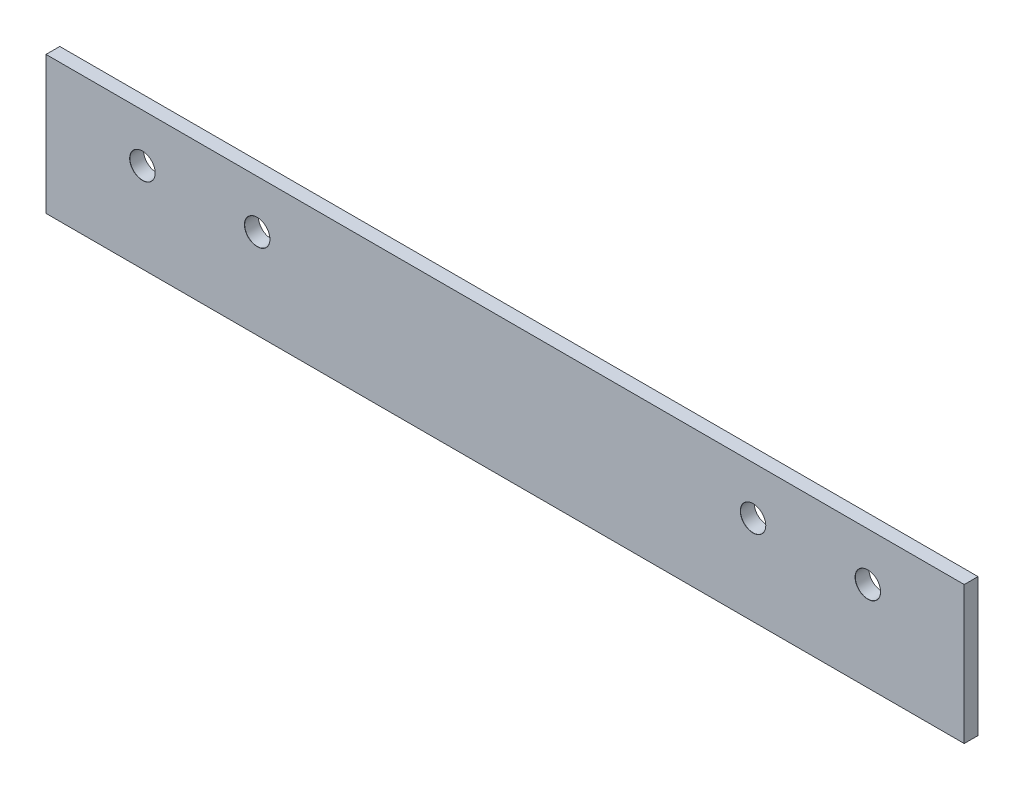
ISO-10303-21;
HEADER;
FILE_DESCRIPTION(('STEP AP214'),'2;1');
FILE_NAME('part.step','',(''),(''),'','','');
FILE_SCHEMA(('AUTOMOTIVE_DESIGN { 1 0 10303 214 1 1 1 1 }'));
ENDSEC;
DATA;
#1=APPLICATION_CONTEXT('core data for automotive mechanical design processes');
#2=APPLICATION_PROTOCOL_DEFINITION('international standard','automotive_design',2000,#1);
#3=PRODUCT_CONTEXT('',#1,'mechanical');
#4=PRODUCT('Part','Part','',(#3));
#5=PRODUCT_RELATED_PRODUCT_CATEGORY('part','',(#4));
#6=PRODUCT_DEFINITION_FORMATION('','',#4);
#7=PRODUCT_DEFINITION_CONTEXT('part definition',#1,'design');
#8=PRODUCT_DEFINITION('design','',#6,#7);
#9=PRODUCT_DEFINITION_SHAPE('','',#8);
#10=(LENGTH_UNIT() NAMED_UNIT(*) SI_UNIT(.MILLI.,.METRE.));
#11=(NAMED_UNIT(*) PLANE_ANGLE_UNIT() SI_UNIT($,.RADIAN.));
#12=(NAMED_UNIT(*) SI_UNIT($,.STERADIAN.) SOLID_ANGLE_UNIT());
#13=UNCERTAINTY_MEASURE_WITH_UNIT(LENGTH_MEASURE(1.E-05),#10,'distance_accuracy_value','');
#14=(GEOMETRIC_REPRESENTATION_CONTEXT(3) GLOBAL_UNCERTAINTY_ASSIGNED_CONTEXT((#13)) GLOBAL_UNIT_ASSIGNED_CONTEXT((#10,
#11,#12)) REPRESENTATION_CONTEXT('',''));
#15=CARTESIAN_POINT('',(0.,0.,0.));
#16=DIRECTION('',(0.,0.,1.));
#17=DIRECTION('',(1.,0.,0.));
#18=AXIS2_PLACEMENT_3D('',#15,#16,#17);
#19=CARTESIAN_POINT('',(-100.,15.,1.5));
#20=DIRECTION('',(1.,0.,0.));
#21=DIRECTION('',(0.,1.,0.));
#22=AXIS2_PLACEMENT_3D('',#19,#20,#21);
#23=PLANE('',#22);
#24=DIRECTION('',(0.,-1.,0.));
#25=VECTOR('',#24,1.);
#26=CARTESIAN_POINT('',(-100.,15.,-1.5));
#27=LINE('',#26,#25);
#28=CARTESIAN_POINT('',(-100.,15.,-1.5));
#29=VERTEX_POINT('',#28);
#30=CARTESIAN_POINT('',(-100.,-15.,-1.5));
#31=VERTEX_POINT('',#30);
#32=EDGE_CURVE('E119',#29,#31,#27,.T.);
#33=ORIENTED_EDGE('',*,*,#32,.T.);
#34=DIRECTION('',(0.,0.,-1.));
#35=VECTOR('',#34,1.);
#36=CARTESIAN_POINT('',(-100.,-15.,1.5));
#37=LINE('',#36,#35);
#38=CARTESIAN_POINT('',(-100.,-15.,1.5));
#39=VERTEX_POINT('',#38);
#40=EDGE_CURVE('E12',#39,#31,#37,.T.);
#41=ORIENTED_EDGE('',*,*,#40,.F.);
#42=DIRECTION('',(0.,-1.,0.));
#43=VECTOR('',#42,1.);
#44=CARTESIAN_POINT('',(-100.,15.,1.5));
#45=LINE('',#44,#43);
#46=CARTESIAN_POINT('',(-100.,15.,1.5));
#47=VERTEX_POINT('',#46);
#48=EDGE_CURVE('E101',#47,#39,#45,.T.);
#49=ORIENTED_EDGE('',*,*,#48,.F.);
#50=DIRECTION('',(0.,0.,-1.));
#51=VECTOR('',#50,1.);
#52=CARTESIAN_POINT('',(-100.,15.,1.5));
#53=LINE('',#52,#51);
#54=EDGE_CURVE('E111',#47,#29,#53,.T.);
#55=ORIENTED_EDGE('',*,*,#54,.T.);
#56=EDGE_LOOP('',(#33,#41,#49,#55));
#57=FACE_BOUND('',#56,.T.);
#58=ADVANCED_FACE('F47',(#57),#23,.F.);
#59=CARTESIAN_POINT('',(100.,-15.,1.5));
#60=DIRECTION('',(0.,1.,0.));
#61=DIRECTION('',(-1.,0.,0.));
#62=AXIS2_PLACEMENT_3D('',#59,#60,#61);
#63=PLANE('',#62);
#64=DIRECTION('',(1.,0.,0.));
#65=VECTOR('',#64,1.);
#66=CARTESIAN_POINT('',(100.,-15.,-1.5));
#67=LINE('',#66,#65);
#68=CARTESIAN_POINT('',(100.,-15.,-1.5));
#69=VERTEX_POINT('',#68);
#70=EDGE_CURVE('E106',#31,#69,#67,.T.);
#71=ORIENTED_EDGE('',*,*,#70,.T.);
#72=DIRECTION('',(0.,0.,-1.));
#73=VECTOR('',#72,1.);
#74=CARTESIAN_POINT('',(100.,-15.,1.5));
#75=LINE('',#74,#73);
#76=CARTESIAN_POINT('',(100.,-15.,1.5));
#77=VERTEX_POINT('',#76);
#78=EDGE_CURVE('E59',#77,#69,#75,.T.);
#79=ORIENTED_EDGE('',*,*,#78,.F.);
#80=DIRECTION('',(1.,0.,0.));
#81=VECTOR('',#80,1.);
#82=CARTESIAN_POINT('',(100.,-15.,1.5));
#83=LINE('',#82,#81);
#84=EDGE_CURVE('E96',#39,#77,#83,.T.);
#85=ORIENTED_EDGE('',*,*,#84,.F.);
#86=ORIENTED_EDGE('',*,*,#40,.T.);
#87=EDGE_LOOP('',(#71,#79,#85,#86));
#88=FACE_BOUND('',#87,.T.);
#89=ADVANCED_FACE('F104',(#88),#63,.F.);
#90=CARTESIAN_POINT('',(100.,15.,1.5));
#91=DIRECTION('',(-1.,0.,0.));
#92=DIRECTION('',(0.,-1.,0.));
#93=AXIS2_PLACEMENT_3D('',#90,#91,#92);
#94=PLANE('',#93);
#95=DIRECTION('',(0.,1.,0.));
#96=VECTOR('',#95,1.);
#97=CARTESIAN_POINT('',(100.,15.,-1.5));
#98=LINE('',#97,#96);
#99=CARTESIAN_POINT('',(100.,15.,-1.5));
#100=VERTEX_POINT('',#99);
#101=EDGE_CURVE('E85',#69,#100,#98,.T.);
#102=ORIENTED_EDGE('',*,*,#101,.T.);
#103=DIRECTION('',(0.,0.,-1.));
#104=VECTOR('',#103,1.);
#105=CARTESIAN_POINT('',(100.,15.,1.5));
#106=LINE('',#105,#104);
#107=CARTESIAN_POINT('',(100.,15.,1.5));
#108=VERTEX_POINT('',#107);
#109=EDGE_CURVE('E107',#108,#100,#106,.T.);
#110=ORIENTED_EDGE('',*,*,#109,.F.);
#111=DIRECTION('',(0.,1.,0.));
#112=VECTOR('',#111,1.);
#113=CARTESIAN_POINT('',(100.,15.,1.5));
#114=LINE('',#113,#112);
#115=EDGE_CURVE('E97',#77,#108,#114,.T.);
#116=ORIENTED_EDGE('',*,*,#115,.F.);
#117=ORIENTED_EDGE('',*,*,#78,.T.);
#118=EDGE_LOOP('',(#102,#110,#116,#117));
#119=FACE_BOUND('',#118,.T.);
#120=ADVANCED_FACE('F108',(#119),#94,.F.);
#121=CARTESIAN_POINT('',(100.,15.,1.5));
#122=DIRECTION('',(0.,-1.,0.));
#123=DIRECTION('',(1.,0.,0.));
#124=AXIS2_PLACEMENT_3D('',#121,#122,#123);
#125=PLANE('',#124);
#126=DIRECTION('',(-1.,0.,0.));
#127=VECTOR('',#126,1.);
#128=CARTESIAN_POINT('',(100.,15.,-1.5));
#129=LINE('',#128,#127);
#130=EDGE_CURVE('E90',#100,#29,#129,.T.);
#131=ORIENTED_EDGE('',*,*,#130,.T.);
#132=ORIENTED_EDGE('',*,*,#54,.F.);
#133=DIRECTION('',(-1.,0.,0.));
#134=VECTOR('',#133,1.);
#135=CARTESIAN_POINT('',(100.,15.,1.5));
#136=LINE('',#135,#134);
#137=EDGE_CURVE('E68',#108,#47,#136,.T.);
#138=ORIENTED_EDGE('',*,*,#137,.F.);
#139=ORIENTED_EDGE('',*,*,#109,.T.);
#140=EDGE_LOOP('',(#131,#132,#138,#139));
#141=FACE_BOUND('',#140,.T.);
#142=ADVANCED_FACE('F134',(#141),#125,.F.);
#143=CARTESIAN_POINT('',(0.,0.,1.5));
#144=DIRECTION('',(0.,0.,-1.));
#145=DIRECTION('',(-1.,0.,0.));
#146=AXIS2_PLACEMENT_3D('',#143,#144,#145);
#147=PLANE('',#146);
#148=CARTESIAN_POINT('',(-79.,4.50000000000001,1.5));
#149=DIRECTION('',(0.,0.,1.));
#150=DIRECTION('',(1.,0.,0.));
#151=AXIS2_PLACEMENT_3D('',#148,#149,#150);
#152=CIRCLE('',#151,2.775);
#153=CARTESIAN_POINT('',(-76.225,4.50000000000001,1.5));
#154=VERTEX_POINT('',#153);
#155=EDGE_CURVE('E184',#154,#154,#152,.T.);
#156=ORIENTED_EDGE('',*,*,#155,.F.);
#157=EDGE_LOOP('',(#156));
#158=FACE_BOUND('',#157,.T.);
#159=CARTESIAN_POINT('',(-54.,4.50000000000001,1.5));
#160=DIRECTION('',(0.,0.,1.));
#161=DIRECTION('',(1.,0.,0.));
#162=AXIS2_PLACEMENT_3D('',#159,#160,#161);
#163=CIRCLE('',#162,2.775);
#164=CARTESIAN_POINT('',(-51.225,4.50000000000001,1.5));
#165=VERTEX_POINT('',#164);
#166=EDGE_CURVE('E175',#165,#165,#163,.T.);
#167=ORIENTED_EDGE('',*,*,#166,.F.);
#168=EDGE_LOOP('',(#167));
#169=FACE_BOUND('',#168,.T.);
#170=CARTESIAN_POINT('',(79.,4.50000000000001,1.5));
#171=DIRECTION('',(0.,0.,1.));
#172=DIRECTION('',(1.,0.,0.));
#173=AXIS2_PLACEMENT_3D('',#170,#171,#172);
#174=CIRCLE('',#173,2.775);
#175=CARTESIAN_POINT('',(81.775,4.50000000000001,1.5));
#176=VERTEX_POINT('',#175);
#177=EDGE_CURVE('E159',#176,#176,#174,.T.);
#178=ORIENTED_EDGE('',*,*,#177,.F.);
#179=EDGE_LOOP('',(#178));
#180=FACE_BOUND('',#179,.T.);
#181=CARTESIAN_POINT('',(54.,4.50000000000001,1.5));
#182=DIRECTION('',(0.,0.,1.));
#183=DIRECTION('',(1.,0.,0.));
#184=AXIS2_PLACEMENT_3D('',#181,#182,#183);
#185=CIRCLE('',#184,2.775);
#186=CARTESIAN_POINT('',(56.775,4.50000000000001,1.5));
#187=VERTEX_POINT('',#186);
#188=EDGE_CURVE('E146',#187,#187,#185,.T.);
#189=ORIENTED_EDGE('',*,*,#188,.F.);
#190=EDGE_LOOP('',(#189));
#191=FACE_BOUND('',#190,.T.);
#192=ORIENTED_EDGE('',*,*,#48,.T.);
#193=ORIENTED_EDGE('',*,*,#84,.T.);
#194=ORIENTED_EDGE('',*,*,#115,.T.);
#195=ORIENTED_EDGE('',*,*,#137,.T.);
#196=EDGE_LOOP('',(#192,#193,#194,#195));
#197=FACE_BOUND('',#196,.T.);
#198=ADVANCED_FACE('F100',(#158,#169,#180,#191,#197),#147,.F.);
#199=CARTESIAN_POINT('',(0.,0.,-1.5));
#200=DIRECTION('',(0.,0.,-1.));
#201=DIRECTION('',(-1.,0.,0.));
#202=AXIS2_PLACEMENT_3D('',#199,#200,#201);
#203=PLANE('',#202);
#204=CARTESIAN_POINT('',(-79.,4.50000000000001,-1.5));
#205=DIRECTION('',(0.,0.,1.));
#206=DIRECTION('',(1.,0.,0.));
#207=AXIS2_PLACEMENT_3D('',#204,#205,#206);
#208=CIRCLE('',#207,2.75);
#209=CARTESIAN_POINT('',(-76.25,4.50000000000001,-1.5));
#210=VERTEX_POINT('',#209);
#211=EDGE_CURVE('E178',#210,#210,#208,.T.);
#212=ORIENTED_EDGE('',*,*,#211,.T.);
#213=EDGE_LOOP('',(#212));
#214=FACE_BOUND('',#213,.T.);
#215=CARTESIAN_POINT('',(-54.,4.50000000000001,-1.5));
#216=DIRECTION('',(0.,0.,1.));
#217=DIRECTION('',(1.,0.,0.));
#218=AXIS2_PLACEMENT_3D('',#215,#216,#217);
#219=CIRCLE('',#218,2.75);
#220=CARTESIAN_POINT('',(-51.25,4.50000000000001,-1.5));
#221=VERTEX_POINT('',#220);
#222=EDGE_CURVE('E163',#221,#221,#219,.T.);
#223=ORIENTED_EDGE('',*,*,#222,.T.);
#224=EDGE_LOOP('',(#223));
#225=FACE_BOUND('',#224,.T.);
#226=CARTESIAN_POINT('',(79.,4.50000000000001,-1.5));
#227=DIRECTION('',(0.,0.,1.));
#228=DIRECTION('',(1.,0.,0.));
#229=AXIS2_PLACEMENT_3D('',#226,#227,#228);
#230=CIRCLE('',#229,2.75);
#231=CARTESIAN_POINT('',(81.75,4.50000000000001,-1.5));
#232=VERTEX_POINT('',#231);
#233=EDGE_CURVE('E155',#232,#232,#230,.T.);
#234=ORIENTED_EDGE('',*,*,#233,.T.);
#235=EDGE_LOOP('',(#234));
#236=FACE_BOUND('',#235,.T.);
#237=CARTESIAN_POINT('',(54.,4.50000000000001,-1.5));
#238=DIRECTION('',(0.,0.,1.));
#239=DIRECTION('',(1.,0.,0.));
#240=AXIS2_PLACEMENT_3D('',#237,#238,#239);
#241=CIRCLE('',#240,2.75);
#242=CARTESIAN_POINT('',(56.75,4.50000000000001,-1.5));
#243=VERTEX_POINT('',#242);
#244=EDGE_CURVE('E125',#243,#243,#241,.T.);
#245=ORIENTED_EDGE('',*,*,#244,.T.);
#246=EDGE_LOOP('',(#245));
#247=FACE_BOUND('',#246,.T.);
#248=ORIENTED_EDGE('',*,*,#32,.F.);
#249=ORIENTED_EDGE('',*,*,#130,.F.);
#250=ORIENTED_EDGE('',*,*,#101,.F.);
#251=ORIENTED_EDGE('',*,*,#70,.F.);
#252=EDGE_LOOP('',(#248,#249,#250,#251));
#253=FACE_BOUND('',#252,.T.);
#254=ADVANCED_FACE('F139',(#214,#225,#236,#247,#253),#203,.T.);
#255=CARTESIAN_POINT('',(54.,4.50000000000001,1.5));
#256=DIRECTION('',(0.,0.,1.));
#257=DIRECTION('',(1.,0.,0.));
#258=AXIS2_PLACEMENT_3D('',#255,#256,#257);
#259=CYLINDRICAL_SURFACE('',#258,2.75);
#260=ORIENTED_EDGE('',*,*,#244,.F.);
#261=EDGE_LOOP('',(#260));
#262=FACE_BOUND('',#261,.T.);
#263=CARTESIAN_POINT('',(54.,4.50000000000001,1.475));
#264=DIRECTION('',(0.,0.,1.));
#265=DIRECTION('',(1.,0.,0.));
#266=AXIS2_PLACEMENT_3D('',#263,#264,#265);
#267=CIRCLE('',#266,2.75);
#268=CARTESIAN_POINT('',(56.75,4.50000000000001,1.475));
#269=VERTEX_POINT('',#268);
#270=EDGE_CURVE('E145',#269,#269,#267,.T.);
#271=ORIENTED_EDGE('',*,*,#270,.T.);
#272=EDGE_LOOP('',(#271));
#273=FACE_BOUND('',#272,.T.);
#274=ADVANCED_FACE('F204',(#262,#273),#259,.F.);
#275=CARTESIAN_POINT('',(54.,4.50000000000001,1.5));
#276=DIRECTION('',(0.,0.,1.));
#277=DIRECTION('',(1.,0.,0.));
#278=AXIS2_PLACEMENT_3D('',#275,#276,#277);
#279=CONICAL_SURFACE('',#278,2.775,0.785398163397414);
#280=ORIENTED_EDGE('',*,*,#270,.F.);
#281=EDGE_LOOP('',(#280));
#282=FACE_BOUND('',#281,.T.);
#283=ORIENTED_EDGE('',*,*,#188,.T.);
#284=EDGE_LOOP('',(#283));
#285=FACE_BOUND('',#284,.T.);
#286=ADVANCED_FACE('F203',(#282,#285),#279,.F.);
#287=CARTESIAN_POINT('',(79.,4.50000000000001,1.5));
#288=DIRECTION('',(0.,0.,1.));
#289=DIRECTION('',(1.,0.,0.));
#290=AXIS2_PLACEMENT_3D('',#287,#288,#289);
#291=CYLINDRICAL_SURFACE('',#290,2.75);
#292=ORIENTED_EDGE('',*,*,#233,.F.);
#293=EDGE_LOOP('',(#292));
#294=FACE_BOUND('',#293,.T.);
#295=CARTESIAN_POINT('',(79.,4.50000000000001,1.475));
#296=DIRECTION('',(0.,0.,1.));
#297=DIRECTION('',(1.,0.,0.));
#298=AXIS2_PLACEMENT_3D('',#295,#296,#297);
#299=CIRCLE('',#298,2.75);
#300=CARTESIAN_POINT('',(81.75,4.50000000000001,1.475));
#301=VERTEX_POINT('',#300);
#302=EDGE_CURVE('E156',#301,#301,#299,.T.);
#303=ORIENTED_EDGE('',*,*,#302,.T.);
#304=EDGE_LOOP('',(#303));
#305=FACE_BOUND('',#304,.T.);
#306=ADVANCED_FACE('F201',(#294,#305),#291,.F.);
#307=CARTESIAN_POINT('',(79.,4.50000000000001,1.5));
#308=DIRECTION('',(0.,0.,1.));
#309=DIRECTION('',(1.,0.,0.));
#310=AXIS2_PLACEMENT_3D('',#307,#308,#309);
#311=CONICAL_SURFACE('',#310,2.775,0.785398163397414);
#312=ORIENTED_EDGE('',*,*,#302,.F.);
#313=EDGE_LOOP('',(#312));
#314=FACE_BOUND('',#313,.T.);
#315=ORIENTED_EDGE('',*,*,#177,.T.);
#316=EDGE_LOOP('',(#315));
#317=FACE_BOUND('',#316,.T.);
#318=ADVANCED_FACE('F211',(#314,#317),#311,.F.);
#319=CARTESIAN_POINT('',(-54.,4.50000000000001,1.5));
#320=DIRECTION('',(0.,0.,1.));
#321=DIRECTION('',(1.,0.,0.));
#322=AXIS2_PLACEMENT_3D('',#319,#320,#321);
#323=CYLINDRICAL_SURFACE('',#322,2.75);
#324=ORIENTED_EDGE('',*,*,#222,.F.);
#325=EDGE_LOOP('',(#324));
#326=FACE_BOUND('',#325,.T.);
#327=CARTESIAN_POINT('',(-54.,4.50000000000001,1.475));
#328=DIRECTION('',(0.,0.,1.));
#329=DIRECTION('',(1.,0.,0.));
#330=AXIS2_PLACEMENT_3D('',#327,#328,#329);
#331=CIRCLE('',#330,2.75);
#332=CARTESIAN_POINT('',(-51.25,4.50000000000001,1.475));
#333=VERTEX_POINT('',#332);
#334=EDGE_CURVE('E169',#333,#333,#331,.T.);
#335=ORIENTED_EDGE('',*,*,#334,.T.);
#336=EDGE_LOOP('',(#335));
#337=FACE_BOUND('',#336,.T.);
#338=ADVANCED_FACE('F243',(#326,#337),#323,.F.);
#339=CARTESIAN_POINT('',(-54.,4.50000000000001,1.5));
#340=DIRECTION('',(0.,0.,1.));
#341=DIRECTION('',(1.,0.,0.));
#342=AXIS2_PLACEMENT_3D('',#339,#340,#341);
#343=CONICAL_SURFACE('',#342,2.775,0.785398163397414);
#344=ORIENTED_EDGE('',*,*,#334,.F.);
#345=EDGE_LOOP('',(#344));
#346=FACE_BOUND('',#345,.T.);
#347=ORIENTED_EDGE('',*,*,#166,.T.);
#348=EDGE_LOOP('',(#347));
#349=FACE_BOUND('',#348,.T.);
#350=ADVANCED_FACE('F247',(#346,#349),#343,.F.);
#351=CARTESIAN_POINT('',(-79.,4.50000000000001,1.5));
#352=DIRECTION('',(0.,0.,1.));
#353=DIRECTION('',(1.,0.,0.));
#354=AXIS2_PLACEMENT_3D('',#351,#352,#353);
#355=CYLINDRICAL_SURFACE('',#354,2.75);
#356=ORIENTED_EDGE('',*,*,#211,.F.);
#357=EDGE_LOOP('',(#356));
#358=FACE_BOUND('',#357,.T.);
#359=CARTESIAN_POINT('',(-79.,4.50000000000001,1.475));
#360=DIRECTION('',(0.,0.,1.));
#361=DIRECTION('',(1.,0.,0.));
#362=AXIS2_PLACEMENT_3D('',#359,#360,#361);
#363=CIRCLE('',#362,2.75);
#364=CARTESIAN_POINT('',(-76.25,4.50000000000001,1.475));
#365=VERTEX_POINT('',#364);
#366=EDGE_CURVE('E177',#365,#365,#363,.T.);
#367=ORIENTED_EDGE('',*,*,#366,.T.);
#368=EDGE_LOOP('',(#367));
#369=FACE_BOUND('',#368,.T.);
#370=ADVANCED_FACE('F258',(#358,#369),#355,.F.);
#371=CARTESIAN_POINT('',(-79.,4.50000000000001,1.5));
#372=DIRECTION('',(0.,0.,1.));
#373=DIRECTION('',(1.,0.,0.));
#374=AXIS2_PLACEMENT_3D('',#371,#372,#373);
#375=CONICAL_SURFACE('',#374,2.775,0.785398163397414);
#376=ORIENTED_EDGE('',*,*,#366,.F.);
#377=EDGE_LOOP('',(#376));
#378=FACE_BOUND('',#377,.T.);
#379=ORIENTED_EDGE('',*,*,#155,.T.);
#380=EDGE_LOOP('',(#379));
#381=FACE_BOUND('',#380,.T.);
#382=ADVANCED_FACE('F188',(#378,#381),#375,.F.);
#383=CLOSED_SHELL('',(#58,#89,#120,#142,#198,#254,#274,#286,#306,#318,#338,#350,#370,#382));
#384=MANIFOLD_SOLID_BREP('B2',#383);
#385=ADVANCED_BREP_SHAPE_REPRESENTATION('',(#18,#384),#14);
#386=SHAPE_DEFINITION_REPRESENTATION(#9,#385);
ENDSEC;
END-ISO-10303-21;
